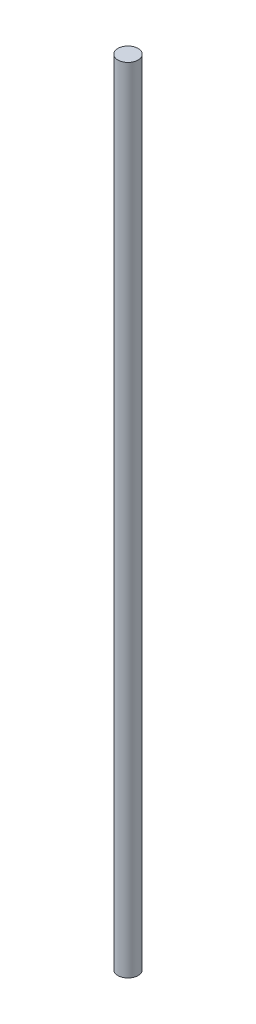
ISO-10303-21;
HEADER;
FILE_DESCRIPTION(('STEP AP214'),'2;1');
FILE_NAME('part.step','',(''),(''),'','','');
FILE_SCHEMA(('AUTOMOTIVE_DESIGN { 1 0 10303 214 1 1 1 1 }'));
ENDSEC;
DATA;
#1=APPLICATION_CONTEXT('core data for automotive mechanical design processes');
#2=APPLICATION_PROTOCOL_DEFINITION('international standard','automotive_design',2000,#1);
#3=PRODUCT_CONTEXT('',#1,'mechanical');
#4=PRODUCT('Part','Part','',(#3));
#5=PRODUCT_RELATED_PRODUCT_CATEGORY('part','',(#4));
#6=PRODUCT_DEFINITION_FORMATION('','',#4);
#7=PRODUCT_DEFINITION_CONTEXT('part definition',#1,'design');
#8=PRODUCT_DEFINITION('design','',#6,#7);
#9=PRODUCT_DEFINITION_SHAPE('','',#8);
#10=(LENGTH_UNIT() NAMED_UNIT(*) SI_UNIT(.MILLI.,.METRE.));
#11=(NAMED_UNIT(*) PLANE_ANGLE_UNIT() SI_UNIT($,.RADIAN.));
#12=(NAMED_UNIT(*) SI_UNIT($,.STERADIAN.) SOLID_ANGLE_UNIT());
#13=UNCERTAINTY_MEASURE_WITH_UNIT(LENGTH_MEASURE(1.E-05),#10,'distance_accuracy_value','');
#14=(GEOMETRIC_REPRESENTATION_CONTEXT(3) GLOBAL_UNCERTAINTY_ASSIGNED_CONTEXT((#13)) GLOBAL_UNIT_ASSIGNED_CONTEXT((#10,
#11,#12)) REPRESENTATION_CONTEXT('',''));
#15=CARTESIAN_POINT('',(0.,0.,0.));
#16=DIRECTION('',(0.,0.,1.));
#17=DIRECTION('',(1.,0.,0.));
#18=AXIS2_PLACEMENT_3D('',#15,#16,#17);
#19=CARTESIAN_POINT('',(0.,315.,0.));
#20=DIRECTION('',(0.,-1.,0.));
#21=DIRECTION('',(0.,0.,-1.));
#22=AXIS2_PLACEMENT_3D('',#19,#20,#21);
#23=CYLINDRICAL_SURFACE('',#22,4.);
#24=CARTESIAN_POINT('',(0.,315.,0.));
#25=DIRECTION('',(0.,1.,0.));
#26=DIRECTION('',(0.,0.,1.));
#27=AXIS2_PLACEMENT_3D('',#24,#25,#26);
#28=CIRCLE('',#27,4.);
#29=CARTESIAN_POINT('',(0.,315.,4.));
#30=VERTEX_POINT('',#29);
#31=EDGE_CURVE('E10',#30,#30,#28,.T.);
#32=ORIENTED_EDGE('',*,*,#31,.F.);
#33=EDGE_LOOP('',(#32));
#34=FACE_BOUND('',#33,.T.);
#35=CARTESIAN_POINT('',(0.,0.,0.));
#36=DIRECTION('',(0.,1.,0.));
#37=DIRECTION('',(0.,0.,1.));
#38=AXIS2_PLACEMENT_3D('',#35,#36,#37);
#39=CIRCLE('',#38,4.);
#40=CARTESIAN_POINT('',(0.,0.,4.));
#41=VERTEX_POINT('',#40);
#42=EDGE_CURVE('E40',#41,#41,#39,.T.);
#43=ORIENTED_EDGE('',*,*,#42,.T.);
#44=EDGE_LOOP('',(#43));
#45=FACE_BOUND('',#44,.T.);
#46=ADVANCED_FACE('F37',(#34,#45),#23,.T.);
#47=CARTESIAN_POINT('',(0.,315.,0.));
#48=DIRECTION('',(0.,1.,0.));
#49=DIRECTION('',(0.,0.,1.));
#50=AXIS2_PLACEMENT_3D('',#47,#48,#49);
#51=PLANE('',#50);
#52=ORIENTED_EDGE('',*,*,#31,.T.);
#53=EDGE_LOOP('',(#52));
#54=FACE_BOUND('',#53,.T.);
#55=ADVANCED_FACE('F54',(#54),#51,.T.);
#56=CARTESIAN_POINT('',(0.,0.,0.));
#57=DIRECTION('',(0.,1.,0.));
#58=DIRECTION('',(0.,0.,1.));
#59=AXIS2_PLACEMENT_3D('',#56,#57,#58);
#60=PLANE('',#59);
#61=ORIENTED_EDGE('',*,*,#42,.F.);
#62=EDGE_LOOP('',(#61));
#63=FACE_BOUND('',#62,.T.);
#64=ADVANCED_FACE('F52',(#63),#60,.F.);
#65=CLOSED_SHELL('',(#46,#55,#64));
#66=MANIFOLD_SOLID_BREP('B2',#65);
#67=ADVANCED_BREP_SHAPE_REPRESENTATION('',(#18,#66),#14);
#68=SHAPE_DEFINITION_REPRESENTATION(#9,#67);
ENDSEC;
END-ISO-10303-21;
